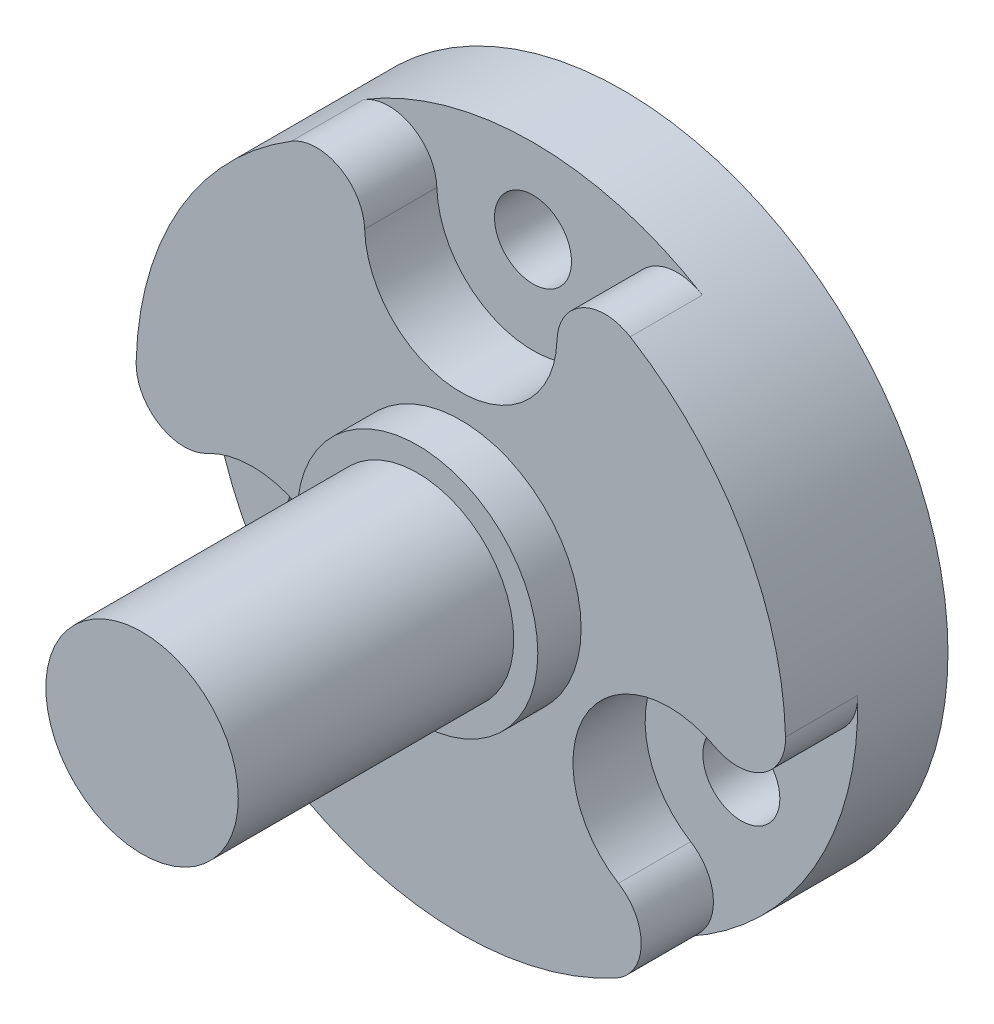
ISO-10303-21;
HEADER;
FILE_DESCRIPTION(('STEP AP214'),'2;1');
FILE_NAME('part.step','',(''),(''),'','','');
FILE_SCHEMA(('AUTOMOTIVE_DESIGN { 1 0 10303 214 1 1 1 1 }'));
ENDSEC;
DATA;
#1=APPLICATION_CONTEXT('core data for automotive mechanical design processes');
#2=APPLICATION_PROTOCOL_DEFINITION('international standard','automotive_design',2000,#1);
#3=PRODUCT_CONTEXT('',#1,'mechanical');
#4=PRODUCT('Part','Part','',(#3));
#5=PRODUCT_RELATED_PRODUCT_CATEGORY('part','',(#4));
#6=PRODUCT_DEFINITION_FORMATION('','',#4);
#7=PRODUCT_DEFINITION_CONTEXT('part definition',#1,'design');
#8=PRODUCT_DEFINITION('design','',#6,#7);
#9=PRODUCT_DEFINITION_SHAPE('','',#8);
#10=(LENGTH_UNIT() NAMED_UNIT(*) SI_UNIT(.MILLI.,.METRE.));
#11=(NAMED_UNIT(*) PLANE_ANGLE_UNIT() SI_UNIT($,.RADIAN.));
#12=(NAMED_UNIT(*) SI_UNIT($,.STERADIAN.) SOLID_ANGLE_UNIT());
#13=UNCERTAINTY_MEASURE_WITH_UNIT(LENGTH_MEASURE(1.E-05),#10,'distance_accuracy_value','');
#14=(GEOMETRIC_REPRESENTATION_CONTEXT(3) GLOBAL_UNCERTAINTY_ASSIGNED_CONTEXT((#13)) GLOBAL_UNIT_ASSIGNED_CONTEXT((#10,
#11,#12)) REPRESENTATION_CONTEXT('',''));
#15=CARTESIAN_POINT('',(0.,0.,0.));
#16=DIRECTION('',(0.,0.,1.));
#17=DIRECTION('',(1.,0.,0.));
#18=AXIS2_PLACEMENT_3D('',#15,#16,#17);
#19=CARTESIAN_POINT('',(-8.66025403784439,-5.,0.));
#20=DIRECTION('',(0.,0.,1.));
#21=DIRECTION('',(1.,0.,0.));
#22=AXIS2_PLACEMENT_3D('',#19,#20,#21);
#23=CYLINDRICAL_SURFACE('',#22,1.6);
#24=CARTESIAN_POINT('',(-8.66025403784439,-5.,0.));
#25=DIRECTION('',(0.,0.,1.));
#26=DIRECTION('',(1.,0.,0.));
#27=AXIS2_PLACEMENT_3D('',#24,#25,#26);
#28=CIRCLE('',#27,1.6);
#29=CARTESIAN_POINT('',(-7.06025403784438,-5.,0.));
#30=VERTEX_POINT('',#29);
#31=EDGE_CURVE('E239',#30,#30,#28,.T.);
#32=ORIENTED_EDGE('',*,*,#31,.F.);
#33=EDGE_LOOP('',(#32));
#34=FACE_BOUND('',#33,.T.);
#35=CARTESIAN_POINT('',(-8.66025403784439,-5.,3.75));
#36=DIRECTION('',(0.,0.,1.));
#37=DIRECTION('',(1.,0.,0.));
#38=AXIS2_PLACEMENT_3D('',#35,#36,#37);
#39=CIRCLE('',#38,1.6);
#40=CARTESIAN_POINT('',(-7.06025403784438,-5.,3.75));
#41=VERTEX_POINT('',#40);
#42=EDGE_CURVE('E218',#41,#41,#39,.T.);
#43=ORIENTED_EDGE('',*,*,#42,.T.);
#44=EDGE_LOOP('',(#43));
#45=FACE_BOUND('',#44,.T.);
#46=ADVANCED_FACE('F34',(#34,#45),#23,.F.);
#47=CARTESIAN_POINT('',(8.66025403784439,-5.,0.));
#48=DIRECTION('',(0.,0.,1.));
#49=DIRECTION('',(1.,0.,0.));
#50=AXIS2_PLACEMENT_3D('',#47,#48,#49);
#51=CYLINDRICAL_SURFACE('',#50,1.6);
#52=CARTESIAN_POINT('',(8.66025403784439,-5.,0.));
#53=DIRECTION('',(0.,0.,1.));
#54=DIRECTION('',(1.,0.,0.));
#55=AXIS2_PLACEMENT_3D('',#52,#53,#54);
#56=CIRCLE('',#55,1.6);
#57=CARTESIAN_POINT('',(10.2602540378444,-5.,0.));
#58=VERTEX_POINT('',#57);
#59=EDGE_CURVE('E244',#58,#58,#56,.T.);
#60=ORIENTED_EDGE('',*,*,#59,.F.);
#61=EDGE_LOOP('',(#60));
#62=FACE_BOUND('',#61,.T.);
#63=CARTESIAN_POINT('',(8.66025403784439,-5.,3.75));
#64=DIRECTION('',(0.,0.,1.));
#65=DIRECTION('',(1.,0.,0.));
#66=AXIS2_PLACEMENT_3D('',#63,#64,#65);
#67=CIRCLE('',#66,1.6);
#68=CARTESIAN_POINT('',(10.2602540378444,-5.,3.75));
#69=VERTEX_POINT('',#68);
#70=EDGE_CURVE('E211',#69,#69,#67,.T.);
#71=ORIENTED_EDGE('',*,*,#70,.T.);
#72=EDGE_LOOP('',(#71));
#73=FACE_BOUND('',#72,.T.);
#74=ADVANCED_FACE('F298',(#62,#73),#51,.F.);
#75=CARTESIAN_POINT('',(0.,10.,0.));
#76=DIRECTION('',(0.,0.,1.));
#77=DIRECTION('',(1.,0.,0.));
#78=AXIS2_PLACEMENT_3D('',#75,#76,#77);
#79=CYLINDRICAL_SURFACE('',#78,1.6);
#80=CARTESIAN_POINT('',(0.,10.,0.));
#81=DIRECTION('',(0.,0.,1.));
#82=DIRECTION('',(1.,0.,0.));
#83=AXIS2_PLACEMENT_3D('',#80,#81,#82);
#84=CIRCLE('',#83,1.6);
#85=CARTESIAN_POINT('',(1.6,10.,0.));
#86=VERTEX_POINT('',#85);
#87=EDGE_CURVE('E240',#86,#86,#84,.T.);
#88=ORIENTED_EDGE('',*,*,#87,.F.);
#89=EDGE_LOOP('',(#88));
#90=FACE_BOUND('',#89,.T.);
#91=CARTESIAN_POINT('',(0.,10.,3.75));
#92=DIRECTION('',(0.,0.,1.));
#93=DIRECTION('',(1.,0.,0.));
#94=AXIS2_PLACEMENT_3D('',#91,#92,#93);
#95=CIRCLE('',#94,1.6);
#96=CARTESIAN_POINT('',(1.6,10.,3.75));
#97=VERTEX_POINT('',#96);
#98=EDGE_CURVE('E204',#97,#97,#95,.T.);
#99=ORIENTED_EDGE('',*,*,#98,.T.);
#100=EDGE_LOOP('',(#99));
#101=FACE_BOUND('',#100,.T.);
#102=ADVANCED_FACE('F304',(#90,#101),#79,.F.);
#103=CARTESIAN_POINT('',(0.,0.,6.75));
#104=DIRECTION('',(0.,0.,1.));
#105=DIRECTION('',(1.,0.,0.));
#106=AXIS2_PLACEMENT_3D('',#103,#104,#105);
#107=PLANE('',#106);
#108=CARTESIAN_POINT('',(0.,0.,6.75));
#109=DIRECTION('',(0.,0.,1.));
#110=DIRECTION('',(1.,0.,0.));
#111=AXIS2_PLACEMENT_3D('',#108,#109,#110);
#112=CIRCLE('',#111,13.5);
#113=CARTESIAN_POINT('',(-7.04003822244172,11.5190217391304,6.75));
#114=VERTEX_POINT('',#113);
#115=CARTESIAN_POINT('',(-13.495784564053,0.337341074682752,6.75));
#116=VERTEX_POINT('',#115);
#117=EDGE_CURVE('E147',#114,#116,#112,.T.);
#118=ORIENTED_EDGE('',*,*,#117,.T.);
#119=CARTESIAN_POINT('',(-11.4964090730822,0.287364619174196,6.75));
#120=DIRECTION('',(0.,0.,1.));
#121=DIRECTION('',(1.,0.,0.));
#122=AXIS2_PLACEMENT_3D('',#119,#120,#121);
#123=CIRCLE('',#122,2.);
#124=CARTESIAN_POINT('',(-10.5510240613363,-1.47509025388387,6.75));
#125=VERTEX_POINT('',#124);
#126=EDGE_CURVE('E171',#116,#125,#123,.T.);
#127=ORIENTED_EDGE('',*,*,#126,.T.);
#128=CARTESIAN_POINT('',(-8.66025403784439,-5.,6.75));
#129=DIRECTION('',(0.,0.,1.));
#130=DIRECTION('',(1.,0.,0.));
#131=AXIS2_PLACEMENT_3D('',#128,#129,#130);
#132=CIRCLE('',#131,4.);
#133=CARTESIAN_POINT('',(-6.55297766340639,-8.39990974611614,6.75));
#134=VERTEX_POINT('',#133);
#135=EDGE_CURVE('E221',#134,#125,#132,.T.);
#136=ORIENTED_EDGE('',*,*,#135,.F.);
#137=CARTESIAN_POINT('',(-5.4993394761874,-10.0998646191742,6.75));
#138=DIRECTION('',(0.,0.,1.));
#139=DIRECTION('',(1.,0.,0.));
#140=AXIS2_PLACEMENT_3D('',#137,#138,#139);
#141=CIRCLE('',#140,2.);
#142=CARTESIAN_POINT('',(-6.45574634161129,-11.8563628138132,6.75));
#143=VERTEX_POINT('',#142);
#144=EDGE_CURVE('E169',#134,#143,#141,.T.);
#145=ORIENTED_EDGE('',*,*,#144,.T.);
#146=CARTESIAN_POINT('',(6.4557463416113,-11.8563628138132,6.75));
#147=VERTEX_POINT('',#146);
#148=EDGE_CURVE('E144',#143,#147,#112,.T.);
#149=ORIENTED_EDGE('',*,*,#148,.T.);
#150=CARTESIAN_POINT('',(5.4993394761874,-10.0998646191742,6.75));
#151=DIRECTION('',(0.,0.,1.));
#152=DIRECTION('',(1.,0.,0.));
#153=AXIS2_PLACEMENT_3D('',#150,#151,#152);
#154=CIRCLE('',#153,2.);
#155=CARTESIAN_POINT('',(6.5529776634064,-8.39990974611614,6.75));
#156=VERTEX_POINT('',#155);
#157=EDGE_CURVE('E134',#147,#156,#154,.T.);
#158=ORIENTED_EDGE('',*,*,#157,.T.);
#159=CARTESIAN_POINT('',(8.66025403784439,-5.,6.75));
#160=DIRECTION('',(0.,0.,1.));
#161=DIRECTION('',(1.,0.,0.));
#162=AXIS2_PLACEMENT_3D('',#159,#160,#161);
#163=CIRCLE('',#162,4.);
#164=CARTESIAN_POINT('',(10.5510240613363,-1.47509025388386,6.75));
#165=VERTEX_POINT('',#164);
#166=EDGE_CURVE('E130',#165,#156,#163,.T.);
#167=ORIENTED_EDGE('',*,*,#166,.F.);
#168=CARTESIAN_POINT('',(11.4964090730822,0.287364619174204,6.75));
#169=DIRECTION('',(0.,0.,1.));
#170=DIRECTION('',(1.,0.,0.));
#171=AXIS2_PLACEMENT_3D('',#168,#169,#170);
#172=CIRCLE('',#171,2.);
#173=CARTESIAN_POINT('',(13.495784564053,0.337341074682761,6.75));
#174=VERTEX_POINT('',#173);
#175=EDGE_CURVE('E123',#165,#174,#172,.T.);
#176=ORIENTED_EDGE('',*,*,#175,.T.);
#177=CARTESIAN_POINT('',(7.04003822244172,11.5190217391304,6.75));
#178=VERTEX_POINT('',#177);
#179=EDGE_CURVE('E128',#174,#178,#112,.T.);
#180=ORIENTED_EDGE('',*,*,#179,.T.);
#181=CARTESIAN_POINT('',(5.9970695968948,9.8125,6.75));
#182=DIRECTION('',(0.,0.,1.));
#183=DIRECTION('',(1.,0.,0.));
#184=AXIS2_PLACEMENT_3D('',#181,#182,#183);
#185=CIRCLE('',#184,2.);
#186=CARTESIAN_POINT('',(3.99804639792987,9.875,6.75));
#187=VERTEX_POINT('',#186);
#188=EDGE_CURVE('E135',#178,#187,#185,.T.);
#189=ORIENTED_EDGE('',*,*,#188,.T.);
#190=CARTESIAN_POINT('',(0.,10.,6.75));
#191=DIRECTION('',(0.,0.,1.));
#192=DIRECTION('',(1.,0.,0.));
#193=AXIS2_PLACEMENT_3D('',#190,#191,#192);
#194=CIRCLE('',#193,4.);
#195=CARTESIAN_POINT('',(-3.99804639792987,9.875,6.75));
#196=VERTEX_POINT('',#195);
#197=EDGE_CURVE('E200',#196,#187,#194,.T.);
#198=ORIENTED_EDGE('',*,*,#197,.F.);
#199=CARTESIAN_POINT('',(-5.9970695968948,9.8125,6.75));
#200=DIRECTION('',(0.,0.,1.));
#201=DIRECTION('',(1.,0.,0.));
#202=AXIS2_PLACEMENT_3D('',#199,#200,#201);
#203=CIRCLE('',#202,2.);
#204=EDGE_CURVE('E165',#196,#114,#203,.T.);
#205=ORIENTED_EDGE('',*,*,#204,.T.);
#206=EDGE_LOOP('',(#118,#127,#136,#145,#149,#158,#167,#176,#180,#189,#198,#205));
#207=FACE_BOUND('',#206,.T.);
#208=CARTESIAN_POINT('',(0.,0.,6.75));
#209=DIRECTION('',(0.,0.,1.));
#210=DIRECTION('',(1.,0.,0.));
#211=AXIS2_PLACEMENT_3D('',#208,#209,#210);
#212=CIRCLE('',#211,5.);
#213=CARTESIAN_POINT('',(5.,0.,6.75));
#214=VERTEX_POINT('',#213);
#215=EDGE_CURVE('E231',#214,#214,#212,.T.);
#216=ORIENTED_EDGE('',*,*,#215,.F.);
#217=EDGE_LOOP('',(#216));
#218=FACE_BOUND('',#217,.T.);
#219=ADVANCED_FACE('F126',(#207,#218),#107,.T.);
#220=CARTESIAN_POINT('',(0.,0.,20.));
#221=DIRECTION('',(0.,0.,-1.));
#222=DIRECTION('',(-1.,0.,0.));
#223=AXIS2_PLACEMENT_3D('',#220,#221,#222);
#224=CYLINDRICAL_SURFACE('',#223,13.5);
#225=CARTESIAN_POINT('',(0.,0.,0.));
#226=DIRECTION('',(0.,0.,1.));
#227=DIRECTION('',(1.,0.,0.));
#228=AXIS2_PLACEMENT_3D('',#225,#226,#227);
#229=CIRCLE('',#228,13.5);
#230=CARTESIAN_POINT('',(13.5,0.,0.));
#231=VERTEX_POINT('',#230);
#232=EDGE_CURVE('E243',#231,#231,#229,.T.);
#233=ORIENTED_EDGE('',*,*,#232,.T.);
#234=EDGE_LOOP('',(#233));
#235=FACE_BOUND('',#234,.T.);
#236=CARTESIAN_POINT('',(0.,0.,3.75));
#237=DIRECTION('',(0.,0.,1.));
#238=DIRECTION('',(1.,0.,0.));
#239=AXIS2_PLACEMENT_3D('',#236,#237,#238);
#240=CIRCLE('',#239,13.5);
#241=CARTESIAN_POINT('',(-13.495784564053,0.337341074682752,3.75));
#242=VERTEX_POINT('',#241);
#243=CARTESIAN_POINT('',(-6.45574634161129,-11.8563628138132,3.75));
#244=VERTEX_POINT('',#243);
#245=EDGE_CURVE('E229',#242,#244,#240,.T.);
#246=ORIENTED_EDGE('',*,*,#245,.F.);
#247=DIRECTION('',(0.,0.,-1.));
#248=VECTOR('',#247,1.);
#249=CARTESIAN_POINT('',(-13.495784564053,0.337341074682752,20.));
#250=LINE('',#249,#248);
#251=EDGE_CURVE('E162',#242,#116,#250,.F.);
#252=ORIENTED_EDGE('',*,*,#251,.T.);
#253=ORIENTED_EDGE('',*,*,#117,.F.);
#254=DIRECTION('',(0.,0.,-1.));
#255=VECTOR('',#254,1.);
#256=CARTESIAN_POINT('',(-7.04003822244173,11.5190217391304,20.));
#257=LINE('',#256,#255);
#258=CARTESIAN_POINT('',(-7.04003822244172,11.5190217391304,3.75));
#259=VERTEX_POINT('',#258);
#260=EDGE_CURVE('E156',#114,#259,#257,.T.);
#261=ORIENTED_EDGE('',*,*,#260,.T.);
#262=CARTESIAN_POINT('',(0.,0.,3.75));
#263=DIRECTION('',(0.,0.,1.));
#264=DIRECTION('',(1.,0.,0.));
#265=AXIS2_PLACEMENT_3D('',#262,#263,#264);
#266=CIRCLE('',#265,13.5);
#267=CARTESIAN_POINT('',(7.04003822244172,11.5190217391304,3.75));
#268=VERTEX_POINT('',#267);
#269=EDGE_CURVE('E195',#268,#259,#266,.T.);
#270=ORIENTED_EDGE('',*,*,#269,.F.);
#271=DIRECTION('',(0.,0.,-1.));
#272=VECTOR('',#271,1.);
#273=CARTESIAN_POINT('',(7.04003822244173,11.5190217391304,20.));
#274=LINE('',#273,#272);
#275=EDGE_CURVE('E143',#268,#178,#274,.F.);
#276=ORIENTED_EDGE('',*,*,#275,.T.);
#277=ORIENTED_EDGE('',*,*,#179,.F.);
#278=DIRECTION('',(0.,0.,-1.));
#279=VECTOR('',#278,1.);
#280=CARTESIAN_POINT('',(13.495784564053,0.337341074682761,20.));
#281=LINE('',#280,#279);
#282=CARTESIAN_POINT('',(13.495784564053,0.337341074682761,3.75));
#283=VERTEX_POINT('',#282);
#284=EDGE_CURVE('E141',#174,#283,#281,.T.);
#285=ORIENTED_EDGE('',*,*,#284,.T.);
#286=CARTESIAN_POINT('',(0.,0.,3.75));
#287=DIRECTION('',(0.,0.,1.));
#288=DIRECTION('',(1.,0.,0.));
#289=AXIS2_PLACEMENT_3D('',#286,#287,#288);
#290=CIRCLE('',#289,13.5);
#291=CARTESIAN_POINT('',(6.4557463416113,-11.8563628138132,3.75));
#292=VERTEX_POINT('',#291);
#293=EDGE_CURVE('E227',#292,#283,#290,.T.);
#294=ORIENTED_EDGE('',*,*,#293,.F.);
#295=DIRECTION('',(0.,0.,-1.));
#296=VECTOR('',#295,1.);
#297=CARTESIAN_POINT('',(6.4557463416113,-11.8563628138132,20.));
#298=LINE('',#297,#296);
#299=EDGE_CURVE('E151',#292,#147,#298,.F.);
#300=ORIENTED_EDGE('',*,*,#299,.T.);
#301=ORIENTED_EDGE('',*,*,#148,.F.);
#302=DIRECTION('',(0.,0.,-1.));
#303=VECTOR('',#302,1.);
#304=CARTESIAN_POINT('',(-6.45574634161129,-11.8563628138132,20.));
#305=LINE('',#304,#303);
#306=EDGE_CURVE('E154',#143,#244,#305,.T.);
#307=ORIENTED_EDGE('',*,*,#306,.T.);
#308=EDGE_LOOP('',(#246,#252,#253,#261,#270,#276,#277,#285,#294,#300,#301,#307));
#309=FACE_BOUND('',#308,.T.);
#310=ADVANCED_FACE('F140',(#235,#309),#224,.T.);
#311=CARTESIAN_POINT('',(0.,0.,0.));
#312=DIRECTION('',(0.,0.,1.));
#313=DIRECTION('',(1.,0.,0.));
#314=AXIS2_PLACEMENT_3D('',#311,#312,#313);
#315=PLANE('',#314);
#316=ORIENTED_EDGE('',*,*,#87,.T.);
#317=EDGE_LOOP('',(#316));
#318=FACE_BOUND('',#317,.T.);
#319=ORIENTED_EDGE('',*,*,#59,.T.);
#320=EDGE_LOOP('',(#319));
#321=FACE_BOUND('',#320,.T.);
#322=ORIENTED_EDGE('',*,*,#31,.T.);
#323=EDGE_LOOP('',(#322));
#324=FACE_BOUND('',#323,.T.);
#325=ORIENTED_EDGE('',*,*,#232,.F.);
#326=EDGE_LOOP('',(#325));
#327=FACE_BOUND('',#326,.T.);
#328=ADVANCED_FACE('F317',(#318,#321,#324,#327),#315,.F.);
#329=CARTESIAN_POINT('',(0.,0.,8.55));
#330=DIRECTION('',(0.,0.,1.));
#331=DIRECTION('',(1.,0.,0.));
#332=AXIS2_PLACEMENT_3D('',#329,#330,#331);
#333=PLANE('',#332);
#334=CARTESIAN_POINT('',(0.,0.,8.55));
#335=DIRECTION('',(0.,0.,1.));
#336=DIRECTION('',(1.,0.,0.));
#337=AXIS2_PLACEMENT_3D('',#334,#335,#336);
#338=CIRCLE('',#337,5.);
#339=CARTESIAN_POINT('',(5.,0.,8.55));
#340=VERTEX_POINT('',#339);
#341=EDGE_CURVE('E232',#340,#340,#338,.T.);
#342=ORIENTED_EDGE('',*,*,#341,.T.);
#343=EDGE_LOOP('',(#342));
#344=FACE_BOUND('',#343,.T.);
#345=CARTESIAN_POINT('',(0.,0.,8.55));
#346=DIRECTION('',(0.,0.,1.));
#347=DIRECTION('',(1.,0.,0.));
#348=AXIS2_PLACEMENT_3D('',#345,#346,#347);
#349=CIRCLE('',#348,4.);
#350=CARTESIAN_POINT('',(4.,0.,8.55));
#351=VERTEX_POINT('',#350);
#352=EDGE_CURVE('E251',#351,#351,#349,.F.);
#353=ORIENTED_EDGE('',*,*,#352,.T.);
#354=EDGE_LOOP('',(#353));
#355=FACE_BOUND('',#354,.T.);
#356=ADVANCED_FACE('F320',(#344,#355),#333,.T.);
#357=CARTESIAN_POINT('',(0.,0.,8.55));
#358=DIRECTION('',(0.,0.,-1.));
#359=DIRECTION('',(-1.,0.,0.));
#360=AXIS2_PLACEMENT_3D('',#357,#358,#359);
#361=CYLINDRICAL_SURFACE('',#360,5.);
#362=ORIENTED_EDGE('',*,*,#341,.F.);
#363=EDGE_LOOP('',(#362));
#364=FACE_BOUND('',#363,.T.);
#365=ORIENTED_EDGE('',*,*,#215,.T.);
#366=EDGE_LOOP('',(#365));
#367=FACE_BOUND('',#366,.T.);
#368=ADVANCED_FACE('F315',(#364,#367),#361,.T.);
#369=CARTESIAN_POINT('',(0.,0.,20.));
#370=DIRECTION('',(0.,0.,1.));
#371=DIRECTION('',(1.,0.,0.));
#372=AXIS2_PLACEMENT_3D('',#369,#370,#371);
#373=PLANE('',#372);
#374=CARTESIAN_POINT('',(0.,0.,20.));
#375=DIRECTION('',(0.,0.,1.));
#376=DIRECTION('',(1.,0.,0.));
#377=AXIS2_PLACEMENT_3D('',#374,#375,#376);
#378=CIRCLE('',#377,4.);
#379=CARTESIAN_POINT('',(4.,0.,20.));
#380=VERTEX_POINT('',#379);
#381=EDGE_CURVE('E145',#380,#380,#378,.T.);
#382=ORIENTED_EDGE('',*,*,#381,.T.);
#383=EDGE_LOOP('',(#382));
#384=FACE_BOUND('',#383,.T.);
#385=ADVANCED_FACE('F311',(#384),#373,.T.);
#386=CARTESIAN_POINT('',(0.,0.,6.75));
#387=DIRECTION('',(0.,0.,1.));
#388=DIRECTION('',(1.,0.,0.));
#389=AXIS2_PLACEMENT_3D('',#386,#387,#388);
#390=CYLINDRICAL_SURFACE('',#389,4.);
#391=ORIENTED_EDGE('',*,*,#352,.F.);
#392=EDGE_LOOP('',(#391));
#393=FACE_BOUND('',#392,.T.);
#394=ORIENTED_EDGE('',*,*,#381,.F.);
#395=EDGE_LOOP('',(#394));
#396=FACE_BOUND('',#395,.T.);
#397=ADVANCED_FACE('F314',(#393,#396),#390,.T.);
#398=CARTESIAN_POINT('',(0.,10.,3.75));
#399=DIRECTION('',(0.,0.,1.));
#400=DIRECTION('',(1.,0.,0.));
#401=AXIS2_PLACEMENT_3D('',#398,#399,#400);
#402=CYLINDRICAL_SURFACE('',#401,4.);
#403=ORIENTED_EDGE('',*,*,#197,.T.);
#404=DIRECTION('',(0.,0.,1.));
#405=VECTOR('',#404,1.);
#406=CARTESIAN_POINT('',(3.99804639792987,9.875,3.75));
#407=LINE('',#406,#405);
#408=CARTESIAN_POINT('',(3.99804639792987,9.875,3.75));
#409=VERTEX_POINT('',#408);
#410=EDGE_CURVE('E49',#187,#409,#407,.F.);
#411=ORIENTED_EDGE('',*,*,#410,.T.);
#412=CARTESIAN_POINT('',(0.,10.,3.75));
#413=DIRECTION('',(0.,0.,1.));
#414=DIRECTION('',(1.,0.,0.));
#415=AXIS2_PLACEMENT_3D('',#412,#413,#414);
#416=CIRCLE('',#415,4.);
#417=CARTESIAN_POINT('',(-3.99804639792987,9.875,3.75));
#418=VERTEX_POINT('',#417);
#419=EDGE_CURVE('E196',#418,#409,#416,.T.);
#420=ORIENTED_EDGE('',*,*,#419,.F.);
#421=DIRECTION('',(0.,0.,1.));
#422=VECTOR('',#421,1.);
#423=CARTESIAN_POINT('',(-3.99804639792987,9.875,3.75));
#424=LINE('',#423,#422);
#425=EDGE_CURVE('E181',#418,#196,#424,.T.);
#426=ORIENTED_EDGE('',*,*,#425,.T.);
#427=EDGE_LOOP('',(#403,#411,#420,#426));
#428=FACE_BOUND('',#427,.T.);
#429=ADVANCED_FACE('F202',(#428),#402,.F.);
#430=CARTESIAN_POINT('',(0.,10.,3.75));
#431=DIRECTION('',(0.,0.,1.));
#432=DIRECTION('',(1.,0.,0.));
#433=AXIS2_PLACEMENT_3D('',#430,#431,#432);
#434=PLANE('',#433);
#435=ORIENTED_EDGE('',*,*,#98,.F.);
#436=EDGE_LOOP('',(#435));
#437=FACE_BOUND('',#436,.T.);
#438=ORIENTED_EDGE('',*,*,#269,.T.);
#439=CARTESIAN_POINT('',(-5.9970695968948,9.8125,3.75));
#440=DIRECTION('',(0.,0.,1.));
#441=DIRECTION('',(1.,0.,0.));
#442=AXIS2_PLACEMENT_3D('',#439,#440,#441);
#443=CIRCLE('',#442,2.);
#444=EDGE_CURVE('E11',#259,#418,#443,.F.);
#445=ORIENTED_EDGE('',*,*,#444,.T.);
#446=ORIENTED_EDGE('',*,*,#419,.T.);
#447=CARTESIAN_POINT('',(5.9970695968948,9.8125,3.75));
#448=DIRECTION('',(0.,0.,1.));
#449=DIRECTION('',(1.,0.,0.));
#450=AXIS2_PLACEMENT_3D('',#447,#448,#449);
#451=CIRCLE('',#450,2.);
#452=EDGE_CURVE('E42',#409,#268,#451,.F.);
#453=ORIENTED_EDGE('',*,*,#452,.T.);
#454=EDGE_LOOP('',(#438,#445,#446,#453));
#455=FACE_BOUND('',#454,.T.);
#456=ADVANCED_FACE('F194',(#437,#455),#434,.T.);
#457=CARTESIAN_POINT('',(8.66025403784439,-5.,3.75));
#458=DIRECTION('',(0.,0.,1.));
#459=DIRECTION('',(1.,0.,0.));
#460=AXIS2_PLACEMENT_3D('',#457,#458,#459);
#461=CYLINDRICAL_SURFACE('',#460,4.);
#462=ORIENTED_EDGE('',*,*,#166,.T.);
#463=DIRECTION('',(0.,0.,1.));
#464=VECTOR('',#463,1.);
#465=CARTESIAN_POINT('',(6.5529776634064,-8.39990974611614,3.75));
#466=LINE('',#465,#464);
#467=CARTESIAN_POINT('',(6.5529776634064,-8.39990974611614,3.75));
#468=VERTEX_POINT('',#467);
#469=EDGE_CURVE('E179',#156,#468,#466,.F.);
#470=ORIENTED_EDGE('',*,*,#469,.T.);
#471=CARTESIAN_POINT('',(8.66025403784439,-5.,3.75));
#472=DIRECTION('',(0.,0.,1.));
#473=DIRECTION('',(1.,0.,0.));
#474=AXIS2_PLACEMENT_3D('',#471,#472,#473);
#475=CIRCLE('',#474,4.);
#476=CARTESIAN_POINT('',(10.5510240613363,-1.47509025388386,3.75));
#477=VERTEX_POINT('',#476);
#478=EDGE_CURVE('E208',#477,#468,#475,.T.);
#479=ORIENTED_EDGE('',*,*,#478,.F.);
#480=DIRECTION('',(0.,0.,1.));
#481=VECTOR('',#480,1.);
#482=CARTESIAN_POINT('',(10.5510240613363,-1.47509025388386,3.75));
#483=LINE('',#482,#481);
#484=EDGE_CURVE('E177',#477,#165,#483,.T.);
#485=ORIENTED_EDGE('',*,*,#484,.T.);
#486=EDGE_LOOP('',(#462,#470,#479,#485));
#487=FACE_BOUND('',#486,.T.);
#488=ADVANCED_FACE('F282',(#487),#461,.F.);
#489=CARTESIAN_POINT('',(8.66025403784439,-5.,3.75));
#490=DIRECTION('',(0.,0.,1.));
#491=DIRECTION('',(1.,0.,0.));
#492=AXIS2_PLACEMENT_3D('',#489,#490,#491);
#493=PLANE('',#492);
#494=ORIENTED_EDGE('',*,*,#70,.F.);
#495=EDGE_LOOP('',(#494));
#496=FACE_BOUND('',#495,.T.);
#497=ORIENTED_EDGE('',*,*,#293,.T.);
#498=CARTESIAN_POINT('',(11.4964090730822,0.287364619174204,3.75));
#499=DIRECTION('',(0.,0.,1.));
#500=DIRECTION('',(1.,0.,0.));
#501=AXIS2_PLACEMENT_3D('',#498,#499,#500);
#502=CIRCLE('',#501,2.);
#503=EDGE_CURVE('E150',#283,#477,#502,.F.);
#504=ORIENTED_EDGE('',*,*,#503,.T.);
#505=ORIENTED_EDGE('',*,*,#478,.T.);
#506=CARTESIAN_POINT('',(5.4993394761874,-10.0998646191742,3.75));
#507=DIRECTION('',(0.,0.,1.));
#508=DIRECTION('',(1.,0.,0.));
#509=AXIS2_PLACEMENT_3D('',#506,#507,#508);
#510=CIRCLE('',#509,2.);
#511=EDGE_CURVE('E189',#468,#292,#510,.F.);
#512=ORIENTED_EDGE('',*,*,#511,.T.);
#513=EDGE_LOOP('',(#497,#504,#505,#512));
#514=FACE_BOUND('',#513,.T.);
#515=ADVANCED_FACE('F285',(#496,#514),#493,.T.);
#516=CARTESIAN_POINT('',(-8.66025403784439,-5.,3.75));
#517=DIRECTION('',(0.,0.,1.));
#518=DIRECTION('',(1.,0.,0.));
#519=AXIS2_PLACEMENT_3D('',#516,#517,#518);
#520=CYLINDRICAL_SURFACE('',#519,4.);
#521=ORIENTED_EDGE('',*,*,#135,.T.);
#522=DIRECTION('',(0.,0.,1.));
#523=VECTOR('',#522,1.);
#524=CARTESIAN_POINT('',(-10.5510240613363,-1.47509025388387,3.75));
#525=LINE('',#524,#523);
#526=CARTESIAN_POINT('',(-10.5510240613363,-1.47509025388387,3.75));
#527=VERTEX_POINT('',#526);
#528=EDGE_CURVE('E175',#125,#527,#525,.F.);
#529=ORIENTED_EDGE('',*,*,#528,.T.);
#530=CARTESIAN_POINT('',(-8.66025403784439,-5.,3.75));
#531=DIRECTION('',(0.,0.,1.));
#532=DIRECTION('',(1.,0.,0.));
#533=AXIS2_PLACEMENT_3D('',#530,#531,#532);
#534=CIRCLE('',#533,4.);
#535=CARTESIAN_POINT('',(-6.55297766340639,-8.39990974611614,3.75));
#536=VERTEX_POINT('',#535);
#537=EDGE_CURVE('E214',#536,#527,#534,.T.);
#538=ORIENTED_EDGE('',*,*,#537,.F.);
#539=DIRECTION('',(0.,0.,1.));
#540=VECTOR('',#539,1.);
#541=CARTESIAN_POINT('',(-6.55297766340639,-8.39990974611614,3.75));
#542=LINE('',#541,#540);
#543=EDGE_CURVE('E173',#536,#134,#542,.T.);
#544=ORIENTED_EDGE('',*,*,#543,.T.);
#545=EDGE_LOOP('',(#521,#529,#538,#544));
#546=FACE_BOUND('',#545,.T.);
#547=ADVANCED_FACE('F263',(#546),#520,.F.);
#548=CARTESIAN_POINT('',(-8.66025403784439,-5.,3.75));
#549=DIRECTION('',(0.,0.,1.));
#550=DIRECTION('',(1.,0.,0.));
#551=AXIS2_PLACEMENT_3D('',#548,#549,#550);
#552=PLANE('',#551);
#553=ORIENTED_EDGE('',*,*,#42,.F.);
#554=EDGE_LOOP('',(#553));
#555=FACE_BOUND('',#554,.T.);
#556=ORIENTED_EDGE('',*,*,#245,.T.);
#557=CARTESIAN_POINT('',(-5.4993394761874,-10.0998646191742,3.75));
#558=DIRECTION('',(0.,0.,1.));
#559=DIRECTION('',(1.,0.,0.));
#560=AXIS2_PLACEMENT_3D('',#557,#558,#559);
#561=CIRCLE('',#560,2.);
#562=EDGE_CURVE('E187',#244,#536,#561,.F.);
#563=ORIENTED_EDGE('',*,*,#562,.T.);
#564=ORIENTED_EDGE('',*,*,#537,.T.);
#565=CARTESIAN_POINT('',(-11.4964090730822,0.287364619174196,3.75));
#566=DIRECTION('',(0.,0.,1.));
#567=DIRECTION('',(1.,0.,0.));
#568=AXIS2_PLACEMENT_3D('',#565,#566,#567);
#569=CIRCLE('',#568,2.);
#570=EDGE_CURVE('E184',#527,#242,#569,.F.);
#571=ORIENTED_EDGE('',*,*,#570,.T.);
#572=EDGE_LOOP('',(#556,#563,#564,#571));
#573=FACE_BOUND('',#572,.T.);
#574=ADVANCED_FACE('F269',(#555,#573),#552,.T.);
#575=CARTESIAN_POINT('',(-11.4964090730822,0.287364619174196,3.75));
#576=DIRECTION('',(0.,0.,-1.));
#577=DIRECTION('',(-1.,0.,0.));
#578=AXIS2_PLACEMENT_3D('',#575,#576,#577);
#579=CYLINDRICAL_SURFACE('',#578,2.);
#580=ORIENTED_EDGE('',*,*,#570,.F.);
#581=ORIENTED_EDGE('',*,*,#528,.F.);
#582=ORIENTED_EDGE('',*,*,#126,.F.);
#583=ORIENTED_EDGE('',*,*,#251,.F.);
#584=EDGE_LOOP('',(#580,#581,#582,#583));
#585=FACE_BOUND('',#584,.T.);
#586=ADVANCED_FACE('F267',(#585),#579,.T.);
#587=CARTESIAN_POINT('',(-5.4993394761874,-10.0998646191742,3.75));
#588=DIRECTION('',(0.,0.,1.));
#589=DIRECTION('',(1.,0.,0.));
#590=AXIS2_PLACEMENT_3D('',#587,#588,#589);
#591=CYLINDRICAL_SURFACE('',#590,2.);
#592=ORIENTED_EDGE('',*,*,#144,.F.);
#593=ORIENTED_EDGE('',*,*,#543,.F.);
#594=ORIENTED_EDGE('',*,*,#562,.F.);
#595=ORIENTED_EDGE('',*,*,#306,.F.);
#596=EDGE_LOOP('',(#592,#593,#594,#595));
#597=FACE_BOUND('',#596,.T.);
#598=ADVANCED_FACE('F272',(#597),#591,.T.);
#599=CARTESIAN_POINT('',(5.4993394761874,-10.0998646191742,3.75));
#600=DIRECTION('',(0.,0.,-1.));
#601=DIRECTION('',(-1.,0.,0.));
#602=AXIS2_PLACEMENT_3D('',#599,#600,#601);
#603=CYLINDRICAL_SURFACE('',#602,2.);
#604=ORIENTED_EDGE('',*,*,#511,.F.);
#605=ORIENTED_EDGE('',*,*,#469,.F.);
#606=ORIENTED_EDGE('',*,*,#157,.F.);
#607=ORIENTED_EDGE('',*,*,#299,.F.);
#608=EDGE_LOOP('',(#604,#605,#606,#607));
#609=FACE_BOUND('',#608,.T.);
#610=ADVANCED_FACE('F279',(#609),#603,.T.);
#611=CARTESIAN_POINT('',(11.4964090730822,0.287364619174204,3.75));
#612=DIRECTION('',(0.,0.,1.));
#613=DIRECTION('',(1.,0.,0.));
#614=AXIS2_PLACEMENT_3D('',#611,#612,#613);
#615=CYLINDRICAL_SURFACE('',#614,2.);
#616=ORIENTED_EDGE('',*,*,#175,.F.);
#617=ORIENTED_EDGE('',*,*,#484,.F.);
#618=ORIENTED_EDGE('',*,*,#503,.F.);
#619=ORIENTED_EDGE('',*,*,#284,.F.);
#620=EDGE_LOOP('',(#616,#617,#618,#619));
#621=FACE_BOUND('',#620,.T.);
#622=ADVANCED_FACE('F149',(#621),#615,.T.);
#623=CARTESIAN_POINT('',(5.9970695968948,9.8125,3.75));
#624=DIRECTION('',(0.,0.,-1.));
#625=DIRECTION('',(-1.,0.,0.));
#626=AXIS2_PLACEMENT_3D('',#623,#624,#625);
#627=CYLINDRICAL_SURFACE('',#626,2.);
#628=ORIENTED_EDGE('',*,*,#452,.F.);
#629=ORIENTED_EDGE('',*,*,#410,.F.);
#630=ORIENTED_EDGE('',*,*,#188,.F.);
#631=ORIENTED_EDGE('',*,*,#275,.F.);
#632=EDGE_LOOP('',(#628,#629,#630,#631));
#633=FACE_BOUND('',#632,.T.);
#634=ADVANCED_FACE('F198',(#633),#627,.T.);
#635=CARTESIAN_POINT('',(-5.9970695968948,9.8125,3.75));
#636=DIRECTION('',(0.,0.,1.));
#637=DIRECTION('',(1.,0.,0.));
#638=AXIS2_PLACEMENT_3D('',#635,#636,#637);
#639=CYLINDRICAL_SURFACE('',#638,2.);
#640=ORIENTED_EDGE('',*,*,#204,.F.);
#641=ORIENTED_EDGE('',*,*,#425,.F.);
#642=ORIENTED_EDGE('',*,*,#444,.F.);
#643=ORIENTED_EDGE('',*,*,#260,.F.);
#644=EDGE_LOOP('',(#640,#641,#642,#643));
#645=FACE_BOUND('',#644,.T.);
#646=ADVANCED_FACE('F36',(#645),#639,.T.);
#647=CLOSED_SHELL('',(#46,#74,#102,#219,#310,#328,#356,#368,#385,#397,#429,#456,#488,#515,#547,
#574,#586,#598,#610,#622,#634,#646));
#648=MANIFOLD_SOLID_BREP('B2',#647);
#649=ADVANCED_BREP_SHAPE_REPRESENTATION('',(#18,#648),#14);
#650=SHAPE_DEFINITION_REPRESENTATION(#9,#649);
ENDSEC;
END-ISO-10303-21;
